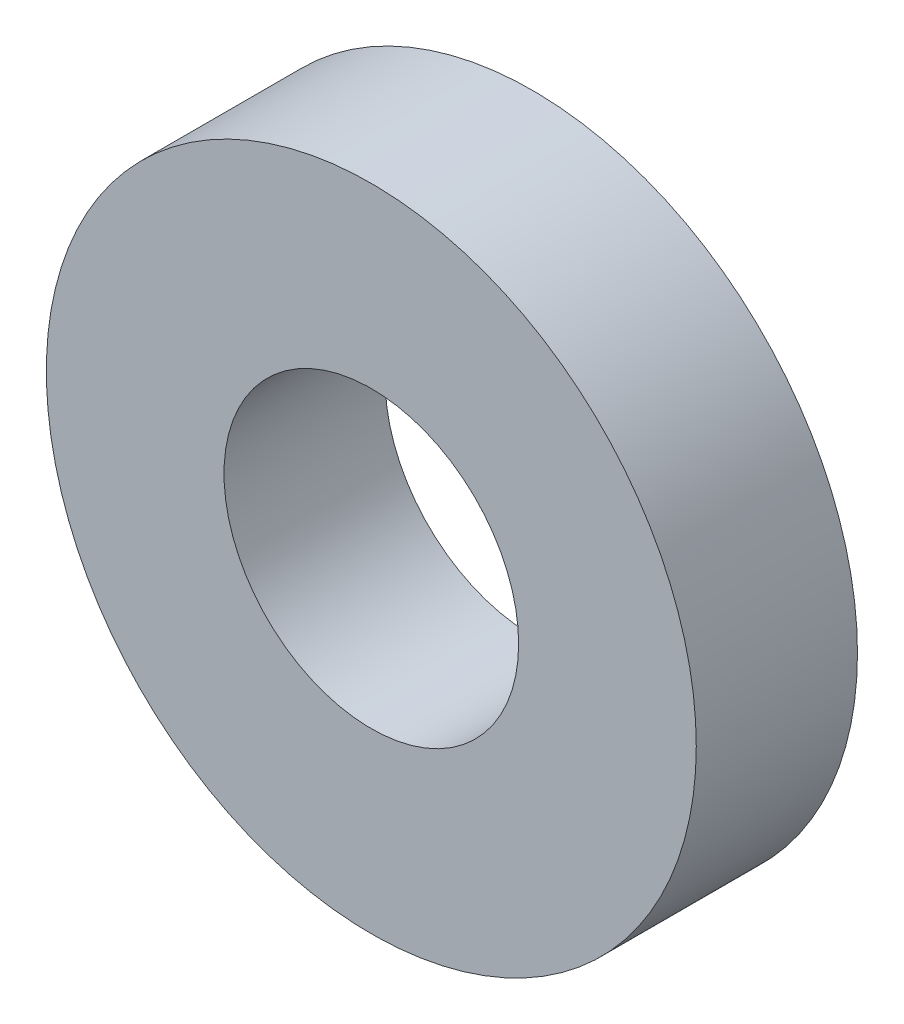
ISO-10303-21;
HEADER;
FILE_DESCRIPTION(('STEP AP214'),'2;1');
FILE_NAME('part.step','',(''),(''),'','','');
FILE_SCHEMA(('AUTOMOTIVE_DESIGN { 1 0 10303 214 1 1 1 1 }'));
ENDSEC;
DATA;
#1=APPLICATION_CONTEXT('core data for automotive mechanical design processes');
#2=APPLICATION_PROTOCOL_DEFINITION('international standard','automotive_design',2000,#1);
#3=PRODUCT_CONTEXT('',#1,'mechanical');
#4=PRODUCT('Part','Part','',(#3));
#5=PRODUCT_RELATED_PRODUCT_CATEGORY('part','',(#4));
#6=PRODUCT_DEFINITION_FORMATION('','',#4);
#7=PRODUCT_DEFINITION_CONTEXT('part definition',#1,'design');
#8=PRODUCT_DEFINITION('design','',#6,#7);
#9=PRODUCT_DEFINITION_SHAPE('','',#8);
#10=(LENGTH_UNIT() NAMED_UNIT(*) SI_UNIT(.MILLI.,.METRE.));
#11=(NAMED_UNIT(*) PLANE_ANGLE_UNIT() SI_UNIT($,.RADIAN.));
#12=(NAMED_UNIT(*) SI_UNIT($,.STERADIAN.) SOLID_ANGLE_UNIT());
#13=UNCERTAINTY_MEASURE_WITH_UNIT(LENGTH_MEASURE(1.E-05),#10,'distance_accuracy_value','');
#14=(GEOMETRIC_REPRESENTATION_CONTEXT(3) GLOBAL_UNCERTAINTY_ASSIGNED_CONTEXT((#13)) GLOBAL_UNIT_ASSIGNED_CONTEXT((#10,
#11,#12)) REPRESENTATION_CONTEXT('',''));
#15=CARTESIAN_POINT('',(0.,0.,0.));
#16=DIRECTION('',(0.,0.,1.));
#17=DIRECTION('',(1.,0.,0.));
#18=AXIS2_PLACEMENT_3D('',#15,#16,#17);
#19=CARTESIAN_POINT('',(-216.241847611488,-397.471903363955,-252.043231195112));
#20=DIRECTION('',(0.,0.,1.));
#21=DIRECTION('',(1.,0.,0.));
#22=AXIS2_PLACEMENT_3D('',#19,#20,#21);
#23=PLANE('',#22);
#24=CARTESIAN_POINT('',(-224.489347611488,-397.471903363955,-252.043231195112));
#25=DIRECTION('',(0.,0.,1.));
#26=DIRECTION('',(1.,0.,0.));
#27=AXIS2_PLACEMENT_3D('',#24,#25,#26);
#28=CIRCLE('',#27,2.159);
#29=CARTESIAN_POINT('',(-222.330347611488,-397.471903363955,-252.043231195112));
#30=VERTEX_POINT('',#29);
#31=EDGE_CURVE('E27',#30,#30,#28,.F.);
#32=ORIENTED_EDGE('',*,*,#31,.T.);
#33=EDGE_LOOP('',(#32));
#34=FACE_BOUND('',#33,.T.);
#35=CARTESIAN_POINT('',(-224.489347611488,-397.471903363955,-252.043231195112));
#36=DIRECTION('',(0.,0.,1.));
#37=DIRECTION('',(1.,0.,0.));
#38=AXIS2_PLACEMENT_3D('',#35,#36,#37);
#39=CIRCLE('',#38,4.7625);
#40=CARTESIAN_POINT('',(-219.726847611488,-397.471903363955,-252.043231195112));
#41=VERTEX_POINT('',#40);
#42=EDGE_CURVE('E18',#41,#41,#39,.F.);
#43=ORIENTED_EDGE('',*,*,#42,.F.);
#44=EDGE_LOOP('',(#43));
#45=FACE_BOUND('',#44,.T.);
#46=ADVANCED_FACE('F15',(#34,#45),#23,.T.);
#47=CARTESIAN_POINT('',(-224.489347611488,-397.471903363955,-254.405431195112));
#48=DIRECTION('',(0.,0.,1.));
#49=DIRECTION('',(1.,0.,0.));
#50=AXIS2_PLACEMENT_3D('',#47,#48,#49);
#51=CYLINDRICAL_SURFACE('',#50,4.7625);
#52=CARTESIAN_POINT('',(-224.489347611488,-397.471903363955,-254.405431195112));
#53=DIRECTION('',(0.,0.,1.));
#54=DIRECTION('',(1.,0.,0.));
#55=AXIS2_PLACEMENT_3D('',#52,#53,#54);
#56=CIRCLE('',#55,4.7625);
#57=CARTESIAN_POINT('',(-219.726847611488,-397.471903363955,-254.405431195112));
#58=VERTEX_POINT('',#57);
#59=EDGE_CURVE('E22',#58,#58,#56,.T.);
#60=ORIENTED_EDGE('',*,*,#59,.T.);
#61=EDGE_LOOP('',(#60));
#62=FACE_BOUND('',#61,.T.);
#63=ORIENTED_EDGE('',*,*,#42,.T.);
#64=EDGE_LOOP('',(#63));
#65=FACE_BOUND('',#64,.T.);
#66=ADVANCED_FACE('F35',(#62,#65),#51,.T.);
#67=CARTESIAN_POINT('',(-224.489347611488,-397.471903363955,-254.405431195112));
#68=DIRECTION('',(0.,0.,1.));
#69=DIRECTION('',(1.,0.,0.));
#70=AXIS2_PLACEMENT_3D('',#67,#68,#69);
#71=CYLINDRICAL_SURFACE('',#70,2.159);
#72=CARTESIAN_POINT('',(-224.489347611488,-397.471903363955,-254.405431195112));
#73=DIRECTION('',(0.,0.,1.));
#74=DIRECTION('',(1.,0.,0.));
#75=AXIS2_PLACEMENT_3D('',#72,#73,#74);
#76=CIRCLE('',#75,2.159);
#77=CARTESIAN_POINT('',(-222.330347611488,-397.471903363955,-254.405431195112));
#78=VERTEX_POINT('',#77);
#79=EDGE_CURVE('E10',#78,#78,#76,.F.);
#80=ORIENTED_EDGE('',*,*,#79,.T.);
#81=EDGE_LOOP('',(#80));
#82=FACE_BOUND('',#81,.T.);
#83=ORIENTED_EDGE('',*,*,#31,.F.);
#84=EDGE_LOOP('',(#83));
#85=FACE_BOUND('',#84,.T.);
#86=ADVANCED_FACE('F42',(#82,#85),#71,.F.);
#87=CARTESIAN_POINT('',(-216.241847611488,-397.471903363955,-254.405431195112));
#88=DIRECTION('',(0.,0.,1.));
#89=DIRECTION('',(1.,0.,0.));
#90=AXIS2_PLACEMENT_3D('',#87,#88,#89);
#91=PLANE('',#90);
#92=ORIENTED_EDGE('',*,*,#79,.F.);
#93=EDGE_LOOP('',(#92));
#94=FACE_BOUND('',#93,.T.);
#95=ORIENTED_EDGE('',*,*,#59,.F.);
#96=EDGE_LOOP('',(#95));
#97=FACE_BOUND('',#96,.T.);
#98=ADVANCED_FACE('F44',(#94,#97),#91,.F.);
#99=CLOSED_SHELL('',(#46,#66,#86,#98));
#100=MANIFOLD_SOLID_BREP('B1',#99);
#101=ADVANCED_BREP_SHAPE_REPRESENTATION('',(#18,#100),#14);
#102=SHAPE_DEFINITION_REPRESENTATION(#9,#101);
ENDSEC;
END-ISO-10303-21;
